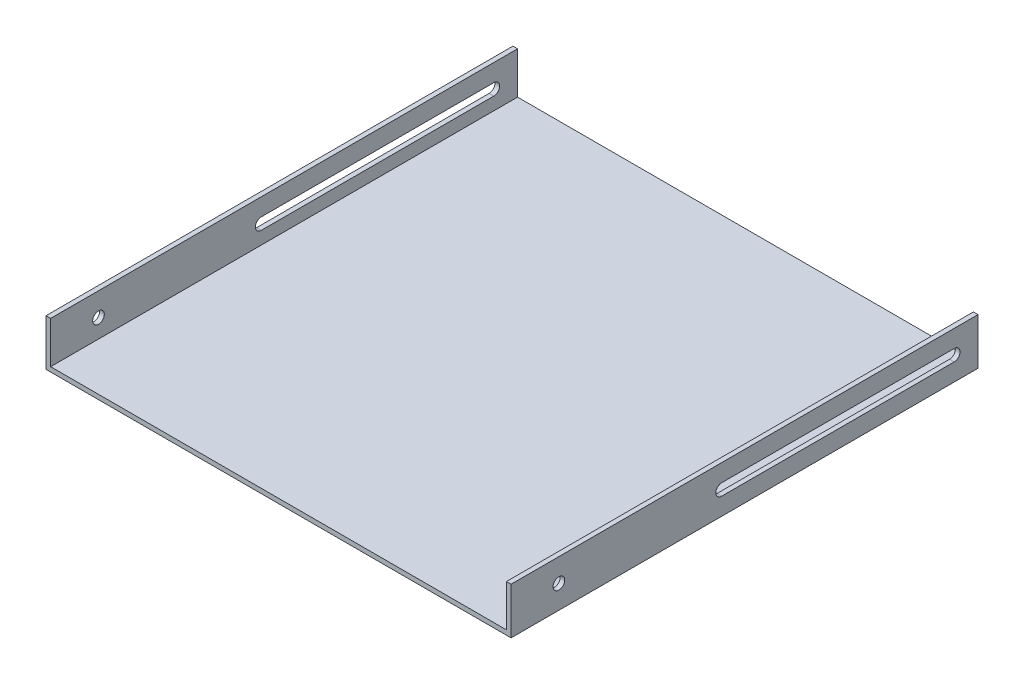
ISO-10303-21;
HEADER;
FILE_DESCRIPTION(('STEP AP214'),'2;1');
FILE_NAME('part.step','',(''),(''),'','','');
FILE_SCHEMA(('AUTOMOTIVE_DESIGN { 1 0 10303 214 1 1 1 1 }'));
ENDSEC;
DATA;
#1=APPLICATION_CONTEXT('core data for automotive mechanical design processes');
#2=APPLICATION_PROTOCOL_DEFINITION('international standard','automotive_design',2000,#1);
#3=PRODUCT_CONTEXT('',#1,'mechanical');
#4=PRODUCT('Part','Part','',(#3));
#5=PRODUCT_RELATED_PRODUCT_CATEGORY('part','',(#4));
#6=PRODUCT_DEFINITION_FORMATION('','',#4);
#7=PRODUCT_DEFINITION_CONTEXT('part definition',#1,'design');
#8=PRODUCT_DEFINITION('design','',#6,#7);
#9=PRODUCT_DEFINITION_SHAPE('','',#8);
#10=(LENGTH_UNIT() NAMED_UNIT(*) SI_UNIT(.MILLI.,.METRE.));
#11=(NAMED_UNIT(*) PLANE_ANGLE_UNIT() SI_UNIT($,.RADIAN.));
#12=(NAMED_UNIT(*) SI_UNIT($,.STERADIAN.) SOLID_ANGLE_UNIT());
#13=UNCERTAINTY_MEASURE_WITH_UNIT(LENGTH_MEASURE(1.E-05),#10,'distance_accuracy_value','');
#14=(GEOMETRIC_REPRESENTATION_CONTEXT(3) GLOBAL_UNCERTAINTY_ASSIGNED_CONTEXT((#13)) GLOBAL_UNIT_ASSIGNED_CONTEXT((#10,
#11,#12)) REPRESENTATION_CONTEXT('',''));
#15=CARTESIAN_POINT('',(0.,0.,0.));
#16=DIRECTION('',(0.,0.,1.));
#17=DIRECTION('',(1.,0.,0.));
#18=AXIS2_PLACEMENT_3D('',#15,#16,#17);
#19=CARTESIAN_POINT('',(-98.,1.99999999999999,160.));
#20=DIRECTION('',(-1.,0.,0.));
#21=DIRECTION('',(0.,0.,1.));
#22=AXIS2_PLACEMENT_3D('',#19,#20,#21);
#23=PLANE('',#22);
#24=CARTESIAN_POINT('',(-98.,10.,75.16));
#25=DIRECTION('',(-1.,0.,0.));
#26=DIRECTION('',(0.,0.,1.));
#27=AXIS2_PLACEMENT_3D('',#24,#25,#26);
#28=CIRCLE('',#27,2.5);
#29=CARTESIAN_POINT('',(-98.,10.,77.66));
#30=VERTEX_POINT('',#29);
#31=EDGE_CURVE('E209',#30,#30,#28,.T.);
#32=ORIENTED_EDGE('',*,*,#31,.T.);
#33=EDGE_LOOP('',(#32));
#34=FACE_BOUND('',#33,.T.);
#35=DIRECTION('',(0.,0.,1.));
#36=VECTOR('',#35,1.);
#37=CARTESIAN_POINT('',(-98.,7.49999999999998,160.));
#38=LINE('',#37,#36);
#39=CARTESIAN_POINT('',(-98.,7.50000000000001,-94.84));
#40=VERTEX_POINT('',#39);
#41=CARTESIAN_POINT('',(-98.,7.5,5.16000000000003));
#42=VERTEX_POINT('',#41);
#43=EDGE_CURVE('E252',#40,#42,#38,.T.);
#44=ORIENTED_EDGE('',*,*,#43,.T.);
#45=CARTESIAN_POINT('',(-98.,10.,5.16000000000002));
#46=DIRECTION('',(-1.,0.,0.));
#47=DIRECTION('',(0.,0.,1.));
#48=AXIS2_PLACEMENT_3D('',#45,#46,#47);
#49=CIRCLE('',#48,2.5);
#50=CARTESIAN_POINT('',(-98.,12.5,5.16000000000002));
#51=VERTEX_POINT('',#50);
#52=EDGE_CURVE('E210',#42,#51,#49,.T.);
#53=ORIENTED_EDGE('',*,*,#52,.T.);
#54=DIRECTION('',(0.,0.,-1.));
#55=VECTOR('',#54,1.);
#56=CARTESIAN_POINT('',(-98.,12.5,160.));
#57=LINE('',#56,#55);
#58=CARTESIAN_POINT('',(-98.,12.5,-94.84));
#59=VERTEX_POINT('',#58);
#60=EDGE_CURVE('E313',#51,#59,#57,.T.);
#61=ORIENTED_EDGE('',*,*,#60,.T.);
#62=CARTESIAN_POINT('',(-98.,10.,-94.84));
#63=DIRECTION('',(-1.,0.,0.));
#64=DIRECTION('',(0.,0.,1.));
#65=AXIS2_PLACEMENT_3D('',#62,#63,#64);
#66=CIRCLE('',#65,2.5);
#67=EDGE_CURVE('E309',#59,#40,#66,.T.);
#68=ORIENTED_EDGE('',*,*,#67,.T.);
#69=EDGE_LOOP('',(#44,#53,#61,#68));
#70=FACE_BOUND('',#69,.T.);
#71=DIRECTION('',(0.,0.,-1.));
#72=VECTOR('',#71,1.);
#73=CARTESIAN_POINT('',(-98.,20.,160.));
#74=LINE('',#73,#72);
#75=CARTESIAN_POINT('',(-98.,20.,95.73389712));
#76=VERTEX_POINT('',#75);
#77=CARTESIAN_POINT('',(-98.,20.,-105.06183505093));
#78=VERTEX_POINT('',#77);
#79=EDGE_CURVE('E182',#76,#78,#74,.T.);
#80=ORIENTED_EDGE('',*,*,#79,.F.);
#81=DIRECTION('',(0.,-1.,0.));
#82=VECTOR('',#81,1.);
#83=CARTESIAN_POINT('',(-98.,1.99999999999999,95.73389712));
#84=LINE('',#83,#82);
#85=CARTESIAN_POINT('',(-98.,1.99999999999999,95.73389712));
#86=VERTEX_POINT('',#85);
#87=EDGE_CURVE('E343',#76,#86,#84,.T.);
#88=ORIENTED_EDGE('',*,*,#87,.T.);
#89=DIRECTION('',(0.,0.,-1.));
#90=VECTOR('',#89,1.);
#91=CARTESIAN_POINT('',(-98.,1.99999999999999,160.));
#92=LINE('',#91,#90);
#93=CARTESIAN_POINT('',(-98.,1.99999999999999,-105.06183505093));
#94=VERTEX_POINT('',#93);
#95=EDGE_CURVE('E61',#86,#94,#92,.T.);
#96=ORIENTED_EDGE('',*,*,#95,.T.);
#97=DIRECTION('',(0.,1.,0.));
#98=VECTOR('',#97,1.);
#99=CARTESIAN_POINT('',(-98.,1.99999999999999,-105.06183505093));
#100=LINE('',#99,#98);
#101=EDGE_CURVE('E226',#94,#78,#100,.T.);
#102=ORIENTED_EDGE('',*,*,#101,.T.);
#103=EDGE_LOOP('',(#80,#88,#96,#102));
#104=FACE_BOUND('',#103,.T.);
#105=ADVANCED_FACE('F39',(#34,#70,#104),#23,.F.);
#106=CARTESIAN_POINT('',(-98.,20.,160.));
#107=DIRECTION('',(0.,-1.,0.));
#108=DIRECTION('',(1.,0.,0.));
#109=AXIS2_PLACEMENT_3D('',#106,#107,#108);
#110=PLANE('',#109);
#111=DIRECTION('',(0.,0.,-1.));
#112=VECTOR('',#111,1.);
#113=CARTESIAN_POINT('',(-100.,20.,160.));
#114=LINE('',#113,#112);
#115=CARTESIAN_POINT('',(-100.,20.,95.73389712));
#116=VERTEX_POINT('',#115);
#117=CARTESIAN_POINT('',(-100.,20.,-105.06183505093));
#118=VERTEX_POINT('',#117);
#119=EDGE_CURVE('E178',#116,#118,#114,.T.);
#120=ORIENTED_EDGE('',*,*,#119,.F.);
#121=DIRECTION('',(1.,0.,0.));
#122=VECTOR('',#121,1.);
#123=CARTESIAN_POINT('',(-98.,20.,95.73389712));
#124=LINE('',#123,#122);
#125=EDGE_CURVE('E157',#116,#76,#124,.T.);
#126=ORIENTED_EDGE('',*,*,#125,.T.);
#127=ORIENTED_EDGE('',*,*,#79,.T.);
#128=DIRECTION('',(-1.,0.,0.));
#129=VECTOR('',#128,1.);
#130=CARTESIAN_POINT('',(-98.,20.,-105.06183505093));
#131=LINE('',#130,#129);
#132=EDGE_CURVE('E243',#78,#118,#131,.T.);
#133=ORIENTED_EDGE('',*,*,#132,.T.);
#134=EDGE_LOOP('',(#120,#126,#127,#133));
#135=FACE_BOUND('',#134,.T.);
#136=ADVANCED_FACE('F355',(#135),#110,.F.);
#137=CARTESIAN_POINT('',(-100.,20.,160.));
#138=DIRECTION('',(1.,0.,0.));
#139=DIRECTION('',(0.,0.,-1.));
#140=AXIS2_PLACEMENT_3D('',#137,#138,#139);
#141=PLANE('',#140);
#142=CARTESIAN_POINT('',(-100.,10.,75.16));
#143=DIRECTION('',(1.,0.,0.));
#144=DIRECTION('',(0.,0.,-1.));
#145=AXIS2_PLACEMENT_3D('',#142,#143,#144);
#146=CIRCLE('',#145,2.5);
#147=CARTESIAN_POINT('',(-100.,10.,72.66));
#148=VERTEX_POINT('',#147);
#149=EDGE_CURVE('E248',#148,#148,#146,.T.);
#150=ORIENTED_EDGE('',*,*,#149,.T.);
#151=EDGE_LOOP('',(#150));
#152=FACE_BOUND('',#151,.T.);
#153=DIRECTION('',(0.,0.,1.));
#154=VECTOR('',#153,1.);
#155=CARTESIAN_POINT('',(-100.,12.5,5.16000000000002));
#156=LINE('',#155,#154);
#157=CARTESIAN_POINT('',(-100.,12.5,-94.84));
#158=VERTEX_POINT('',#157);
#159=CARTESIAN_POINT('',(-100.,12.5,5.16000000000002));
#160=VERTEX_POINT('',#159);
#161=EDGE_CURVE('E271',#158,#160,#156,.T.);
#162=ORIENTED_EDGE('',*,*,#161,.T.);
#163=CARTESIAN_POINT('',(-100.,10.,5.16000000000002));
#164=DIRECTION('',(1.,0.,0.));
#165=DIRECTION('',(0.,0.,-1.));
#166=AXIS2_PLACEMENT_3D('',#163,#164,#165);
#167=CIRCLE('',#166,2.5);
#168=CARTESIAN_POINT('',(-100.,7.5,5.16000000000002));
#169=VERTEX_POINT('',#168);
#170=EDGE_CURVE('E258',#160,#169,#167,.T.);
#171=ORIENTED_EDGE('',*,*,#170,.T.);
#172=DIRECTION('',(0.,0.,-1.));
#173=VECTOR('',#172,1.);
#174=CARTESIAN_POINT('',(-100.,7.5,5.16000000000002));
#175=LINE('',#174,#173);
#176=CARTESIAN_POINT('',(-100.,7.50000000000001,-94.84));
#177=VERTEX_POINT('',#176);
#178=EDGE_CURVE('E262',#169,#177,#175,.T.);
#179=ORIENTED_EDGE('',*,*,#178,.T.);
#180=CARTESIAN_POINT('',(-100.,10.,-94.84));
#181=DIRECTION('',(1.,0.,0.));
#182=DIRECTION('',(0.,0.,-1.));
#183=AXIS2_PLACEMENT_3D('',#180,#181,#182);
#184=CIRCLE('',#183,2.5);
#185=EDGE_CURVE('E267',#177,#158,#184,.T.);
#186=ORIENTED_EDGE('',*,*,#185,.T.);
#187=EDGE_LOOP('',(#162,#171,#179,#186));
#188=FACE_BOUND('',#187,.T.);
#189=DIRECTION('',(0.,0.,-1.));
#190=VECTOR('',#189,1.);
#191=CARTESIAN_POINT('',(-100.,0.,160.));
#192=LINE('',#191,#190);
#193=CARTESIAN_POINT('',(-100.,0.,95.73389712));
#194=VERTEX_POINT('',#193);
#195=CARTESIAN_POINT('',(-100.,0.,-105.06183505093));
#196=VERTEX_POINT('',#195);
#197=EDGE_CURVE('E168',#194,#196,#192,.T.);
#198=ORIENTED_EDGE('',*,*,#197,.F.);
#199=DIRECTION('',(0.,1.,0.));
#200=VECTOR('',#199,1.);
#201=CARTESIAN_POINT('',(-100.,0.,95.73389712));
#202=LINE('',#201,#200);
#203=EDGE_CURVE('E151',#194,#116,#202,.T.);
#204=ORIENTED_EDGE('',*,*,#203,.T.);
#205=ORIENTED_EDGE('',*,*,#119,.T.);
#206=DIRECTION('',(0.,-1.,0.));
#207=VECTOR('',#206,1.);
#208=CARTESIAN_POINT('',(-100.,0.,-105.06183505093));
#209=LINE('',#208,#207);
#210=EDGE_CURVE('E176',#118,#196,#209,.T.);
#211=ORIENTED_EDGE('',*,*,#210,.T.);
#212=EDGE_LOOP('',(#198,#204,#205,#211));
#213=FACE_BOUND('',#212,.T.);
#214=ADVANCED_FACE('F174',(#152,#188,#213),#141,.F.);
#215=CARTESIAN_POINT('',(-100.,0.,160.));
#216=DIRECTION('',(0.,1.,0.));
#217=DIRECTION('',(0.,0.,1.));
#218=AXIS2_PLACEMENT_3D('',#215,#216,#217);
#219=PLANE('',#218);
#220=DIRECTION('',(0.,0.,-1.));
#221=VECTOR('',#220,1.);
#222=CARTESIAN_POINT('',(100.,0.,160.));
#223=LINE('',#222,#221);
#224=CARTESIAN_POINT('',(100.,0.,95.73389712));
#225=VERTEX_POINT('',#224);
#226=CARTESIAN_POINT('',(100.,0.,-105.06183505093));
#227=VERTEX_POINT('',#226);
#228=EDGE_CURVE('E170',#225,#227,#223,.T.);
#229=ORIENTED_EDGE('',*,*,#228,.F.);
#230=DIRECTION('',(1.,0.,0.));
#231=VECTOR('',#230,1.);
#232=CARTESIAN_POINT('',(-100.,0.,95.73389712));
#233=LINE('',#232,#231);
#234=EDGE_CURVE('E154',#194,#225,#233,.T.);
#235=ORIENTED_EDGE('',*,*,#234,.F.);
#236=ORIENTED_EDGE('',*,*,#197,.T.);
#237=DIRECTION('',(1.,0.,0.));
#238=VECTOR('',#237,1.);
#239=CARTESIAN_POINT('',(-100.,0.,-105.06183505093));
#240=LINE('',#239,#238);
#241=EDGE_CURVE('E233',#196,#227,#240,.T.);
#242=ORIENTED_EDGE('',*,*,#241,.T.);
#243=EDGE_LOOP('',(#229,#235,#236,#242));
#244=FACE_BOUND('',#243,.T.);
#245=ADVANCED_FACE('F166',(#244),#219,.F.);
#246=CARTESIAN_POINT('',(100.,0.,160.));
#247=DIRECTION('',(-1.,0.,0.));
#248=DIRECTION('',(0.,0.,1.));
#249=AXIS2_PLACEMENT_3D('',#246,#247,#248);
#250=PLANE('',#249);
#251=CARTESIAN_POINT('',(100.,10.,75.16));
#252=DIRECTION('',(1.,0.,0.));
#253=DIRECTION('',(0.,0.,-1.));
#254=AXIS2_PLACEMENT_3D('',#251,#252,#253);
#255=CIRCLE('',#254,2.5);
#256=CARTESIAN_POINT('',(100.,10.,72.66));
#257=VERTEX_POINT('',#256);
#258=EDGE_CURVE('E253',#257,#257,#255,.T.);
#259=ORIENTED_EDGE('',*,*,#258,.F.);
#260=EDGE_LOOP('',(#259));
#261=FACE_BOUND('',#260,.T.);
#262=DIRECTION('',(0.,0.,-1.));
#263=VECTOR('',#262,1.);
#264=CARTESIAN_POINT('',(100.,7.5,5.16000000000002));
#265=LINE('',#264,#263);
#266=CARTESIAN_POINT('',(100.,7.5,5.16000000000003));
#267=VERTEX_POINT('',#266);
#268=CARTESIAN_POINT('',(100.,7.50000000000001,-94.84));
#269=VERTEX_POINT('',#268);
#270=EDGE_CURVE('E278',#267,#269,#265,.T.);
#271=ORIENTED_EDGE('',*,*,#270,.F.);
#272=CARTESIAN_POINT('',(100.,10.,5.16000000000002));
#273=DIRECTION('',(1.,0.,0.));
#274=DIRECTION('',(0.,0.,-1.));
#275=AXIS2_PLACEMENT_3D('',#272,#273,#274);
#276=CIRCLE('',#275,2.5);
#277=CARTESIAN_POINT('',(100.,12.5,5.16000000000002));
#278=VERTEX_POINT('',#277);
#279=EDGE_CURVE('E247',#278,#267,#276,.T.);
#280=ORIENTED_EDGE('',*,*,#279,.F.);
#281=DIRECTION('',(0.,0.,1.));
#282=VECTOR('',#281,1.);
#283=CARTESIAN_POINT('',(100.,12.5,5.16000000000002));
#284=LINE('',#283,#282);
#285=CARTESIAN_POINT('',(100.,12.5,-94.84));
#286=VERTEX_POINT('',#285);
#287=EDGE_CURVE('E263',#286,#278,#284,.T.);
#288=ORIENTED_EDGE('',*,*,#287,.F.);
#289=CARTESIAN_POINT('',(100.,10.,-94.84));
#290=DIRECTION('',(1.,0.,0.));
#291=DIRECTION('',(0.,0.,-1.));
#292=AXIS2_PLACEMENT_3D('',#289,#290,#291);
#293=CIRCLE('',#292,2.5);
#294=EDGE_CURVE('E282',#269,#286,#293,.T.);
#295=ORIENTED_EDGE('',*,*,#294,.F.);
#296=EDGE_LOOP('',(#271,#280,#288,#295));
#297=FACE_BOUND('',#296,.T.);
#298=DIRECTION('',(0.,0.,-1.));
#299=VECTOR('',#298,1.);
#300=CARTESIAN_POINT('',(100.,20.,160.));
#301=LINE('',#300,#299);
#302=CARTESIAN_POINT('',(100.,20.,95.73389712));
#303=VERTEX_POINT('',#302);
#304=CARTESIAN_POINT('',(100.,20.,-105.06183505093));
#305=VERTEX_POINT('',#304);
#306=EDGE_CURVE('E184',#303,#305,#301,.T.);
#307=ORIENTED_EDGE('',*,*,#306,.F.);
#308=DIRECTION('',(0.,1.,0.));
#309=VECTOR('',#308,1.);
#310=CARTESIAN_POINT('',(100.,0.,95.73389712));
#311=LINE('',#310,#309);
#312=EDGE_CURVE('E162',#225,#303,#311,.T.);
#313=ORIENTED_EDGE('',*,*,#312,.F.);
#314=ORIENTED_EDGE('',*,*,#228,.T.);
#315=DIRECTION('',(0.,-1.,0.));
#316=VECTOR('',#315,1.);
#317=CARTESIAN_POINT('',(100.,0.,-105.06183505093));
#318=LINE('',#317,#316);
#319=EDGE_CURVE('E337',#305,#227,#318,.T.);
#320=ORIENTED_EDGE('',*,*,#319,.F.);
#321=EDGE_LOOP('',(#307,#313,#314,#320));
#322=FACE_BOUND('',#321,.T.);
#323=ADVANCED_FACE('F338',(#261,#297,#322),#250,.F.);
#324=CARTESIAN_POINT('',(100.,20.,160.));
#325=DIRECTION('',(0.,-1.,0.));
#326=DIRECTION('',(1.,0.,0.));
#327=AXIS2_PLACEMENT_3D('',#324,#325,#326);
#328=PLANE('',#327);
#329=DIRECTION('',(0.,0.,-1.));
#330=VECTOR('',#329,1.);
#331=CARTESIAN_POINT('',(98.,20.,160.));
#332=LINE('',#331,#330);
#333=CARTESIAN_POINT('',(98.,20.,95.73389712));
#334=VERTEX_POINT('',#333);
#335=CARTESIAN_POINT('',(98.,20.,-105.06183505093));
#336=VERTEX_POINT('',#335);
#337=EDGE_CURVE('E230',#334,#336,#332,.T.);
#338=ORIENTED_EDGE('',*,*,#337,.F.);
#339=DIRECTION('',(1.,0.,0.));
#340=VECTOR('',#339,1.);
#341=CARTESIAN_POINT('',(100.,20.,95.73389712));
#342=LINE('',#341,#340);
#343=EDGE_CURVE('E333',#334,#303,#342,.T.);
#344=ORIENTED_EDGE('',*,*,#343,.T.);
#345=ORIENTED_EDGE('',*,*,#306,.T.);
#346=DIRECTION('',(-1.,0.,0.));
#347=VECTOR('',#346,1.);
#348=CARTESIAN_POINT('',(100.,20.,-105.06183505093));
#349=LINE('',#348,#347);
#350=EDGE_CURVE('E232',#305,#336,#349,.T.);
#351=ORIENTED_EDGE('',*,*,#350,.T.);
#352=EDGE_LOOP('',(#338,#344,#345,#351));
#353=FACE_BOUND('',#352,.T.);
#354=ADVANCED_FACE('F332',(#353),#328,.F.);
#355=CARTESIAN_POINT('',(98.,20.,160.));
#356=DIRECTION('',(1.,0.,0.));
#357=DIRECTION('',(0.,0.,-1.));
#358=AXIS2_PLACEMENT_3D('',#355,#356,#357);
#359=PLANE('',#358);
#360=CARTESIAN_POINT('',(98.,10.,75.16));
#361=DIRECTION('',(1.,0.,0.));
#362=DIRECTION('',(0.,0.,-1.));
#363=AXIS2_PLACEMENT_3D('',#360,#361,#362);
#364=CIRCLE('',#363,2.5);
#365=CARTESIAN_POINT('',(98.,10.,72.66));
#366=VERTEX_POINT('',#365);
#367=EDGE_CURVE('E206',#366,#366,#364,.T.);
#368=ORIENTED_EDGE('',*,*,#367,.T.);
#369=EDGE_LOOP('',(#368));
#370=FACE_BOUND('',#369,.T.);
#371=DIRECTION('',(0.,0.,1.));
#372=VECTOR('',#371,1.);
#373=CARTESIAN_POINT('',(98.,12.5,160.));
#374=LINE('',#373,#372);
#375=CARTESIAN_POINT('',(98.,12.5,-94.84));
#376=VERTEX_POINT('',#375);
#377=CARTESIAN_POINT('',(98.,12.5,5.16000000000002));
#378=VERTEX_POINT('',#377);
#379=EDGE_CURVE('E198',#376,#378,#374,.T.);
#380=ORIENTED_EDGE('',*,*,#379,.T.);
#381=CARTESIAN_POINT('',(98.,10.,5.16000000000002));
#382=DIRECTION('',(1.,0.,0.));
#383=DIRECTION('',(0.,0.,-1.));
#384=AXIS2_PLACEMENT_3D('',#381,#382,#383);
#385=CIRCLE('',#384,2.5);
#386=CARTESIAN_POINT('',(98.,7.5,5.16000000000002));
#387=VERTEX_POINT('',#386);
#388=EDGE_CURVE('E202',#378,#387,#385,.T.);
#389=ORIENTED_EDGE('',*,*,#388,.T.);
#390=DIRECTION('',(0.,0.,-1.));
#391=VECTOR('',#390,1.);
#392=CARTESIAN_POINT('',(98.,7.49999999999998,160.));
#393=LINE('',#392,#391);
#394=CARTESIAN_POINT('',(98.,7.50000000000001,-94.84));
#395=VERTEX_POINT('',#394);
#396=EDGE_CURVE('E190',#387,#395,#393,.T.);
#397=ORIENTED_EDGE('',*,*,#396,.T.);
#398=CARTESIAN_POINT('',(98.,10.,-94.84));
#399=DIRECTION('',(1.,0.,0.));
#400=DIRECTION('',(0.,0.,-1.));
#401=AXIS2_PLACEMENT_3D('',#398,#399,#400);
#402=CIRCLE('',#401,2.5);
#403=EDGE_CURVE('E194',#395,#376,#402,.T.);
#404=ORIENTED_EDGE('',*,*,#403,.T.);
#405=EDGE_LOOP('',(#380,#389,#397,#404));
#406=FACE_BOUND('',#405,.T.);
#407=DIRECTION('',(0.,0.,-1.));
#408=VECTOR('',#407,1.);
#409=CARTESIAN_POINT('',(98.,2.00000000000001,160.));
#410=LINE('',#409,#408);
#411=CARTESIAN_POINT('',(98.,2.00000000000001,95.73389712));
#412=VERTEX_POINT('',#411);
#413=CARTESIAN_POINT('',(98.,2.00000000000001,-105.06183505093));
#414=VERTEX_POINT('',#413);
#415=EDGE_CURVE('E217',#412,#414,#410,.T.);
#416=ORIENTED_EDGE('',*,*,#415,.F.);
#417=DIRECTION('',(0.,1.,0.));
#418=VECTOR('',#417,1.);
#419=CARTESIAN_POINT('',(98.,20.,95.73389712));
#420=LINE('',#419,#418);
#421=EDGE_CURVE('E54',#412,#334,#420,.T.);
#422=ORIENTED_EDGE('',*,*,#421,.T.);
#423=ORIENTED_EDGE('',*,*,#337,.T.);
#424=DIRECTION('',(0.,-1.,0.));
#425=VECTOR('',#424,1.);
#426=CARTESIAN_POINT('',(98.,20.,-105.06183505093));
#427=LINE('',#426,#425);
#428=EDGE_CURVE('E223',#336,#414,#427,.T.);
#429=ORIENTED_EDGE('',*,*,#428,.T.);
#430=EDGE_LOOP('',(#416,#422,#423,#429));
#431=FACE_BOUND('',#430,.T.);
#432=ADVANCED_FACE('F228',(#370,#406,#431),#359,.F.);
#433=CARTESIAN_POINT('',(98.,2.00000000000001,160.));
#434=DIRECTION('',(0.,-1.,0.));
#435=DIRECTION('',(1.,0.,0.));
#436=AXIS2_PLACEMENT_3D('',#433,#434,#435);
#437=PLANE('',#436);
#438=ORIENTED_EDGE('',*,*,#95,.F.);
#439=DIRECTION('',(1.,0.,0.));
#440=VECTOR('',#439,1.);
#441=CARTESIAN_POINT('',(98.,2.00000000000001,95.73389712));
#442=LINE('',#441,#440);
#443=EDGE_CURVE('E11',#86,#412,#442,.T.);
#444=ORIENTED_EDGE('',*,*,#443,.T.);
#445=ORIENTED_EDGE('',*,*,#415,.T.);
#446=DIRECTION('',(-1.,0.,0.));
#447=VECTOR('',#446,1.);
#448=CARTESIAN_POINT('',(98.,2.00000000000001,-105.06183505093));
#449=LINE('',#448,#447);
#450=EDGE_CURVE('E47',#414,#94,#449,.T.);
#451=ORIENTED_EDGE('',*,*,#450,.T.);
#452=EDGE_LOOP('',(#438,#444,#445,#451));
#453=FACE_BOUND('',#452,.T.);
#454=ADVANCED_FACE('F215',(#453),#437,.F.);
#455=CARTESIAN_POINT('',(-100.,7.5,5.16000000000002));
#456=DIRECTION('',(0.,-1.,0.));
#457=DIRECTION('',(0.,0.,-1.));
#458=AXIS2_PLACEMENT_3D('',#455,#456,#457);
#459=PLANE('',#458);
#460=DIRECTION('',(1.,0.,0.));
#461=VECTOR('',#460,1.);
#462=CARTESIAN_POINT('',(-100.,7.5,5.16000000000002));
#463=LINE('',#462,#461);
#464=EDGE_CURVE('E275',#387,#267,#463,.T.);
#465=ORIENTED_EDGE('',*,*,#464,.T.);
#466=ORIENTED_EDGE('',*,*,#270,.T.);
#467=DIRECTION('',(1.,0.,0.));
#468=VECTOR('',#467,1.);
#469=CARTESIAN_POINT('',(-100.,7.50000000000001,-94.84));
#470=LINE('',#469,#468);
#471=EDGE_CURVE('E302',#395,#269,#470,.T.);
#472=ORIENTED_EDGE('',*,*,#471,.F.);
#473=ORIENTED_EDGE('',*,*,#396,.F.);
#474=EDGE_LOOP('',(#465,#466,#472,#473));
#475=FACE_BOUND('',#474,.T.);
#476=ADVANCED_FACE('F377',(#475),#459,.F.);
#477=CARTESIAN_POINT('',(-100.,10.,-94.84));
#478=DIRECTION('',(1.,0.,0.));
#479=DIRECTION('',(0.,0.,-1.));
#480=AXIS2_PLACEMENT_3D('',#477,#478,#479);
#481=CYLINDRICAL_SURFACE('',#480,2.5);
#482=ORIENTED_EDGE('',*,*,#471,.T.);
#483=ORIENTED_EDGE('',*,*,#294,.T.);
#484=DIRECTION('',(1.,0.,0.));
#485=VECTOR('',#484,1.);
#486=CARTESIAN_POINT('',(-100.,12.5,-94.84));
#487=LINE('',#486,#485);
#488=EDGE_CURVE('E297',#376,#286,#487,.T.);
#489=ORIENTED_EDGE('',*,*,#488,.F.);
#490=ORIENTED_EDGE('',*,*,#403,.F.);
#491=EDGE_LOOP('',(#482,#483,#489,#490));
#492=FACE_BOUND('',#491,.T.);
#493=ADVANCED_FACE('F394',(#492),#481,.F.);
#494=CARTESIAN_POINT('',(-100.,12.5,5.16000000000002));
#495=DIRECTION('',(0.,1.,0.));
#496=DIRECTION('',(0.,0.,1.));
#497=AXIS2_PLACEMENT_3D('',#494,#495,#496);
#498=PLANE('',#497);
#499=ORIENTED_EDGE('',*,*,#488,.T.);
#500=ORIENTED_EDGE('',*,*,#287,.T.);
#501=DIRECTION('',(1.,0.,0.));
#502=VECTOR('',#501,1.);
#503=CARTESIAN_POINT('',(-100.,12.5,5.16000000000002));
#504=LINE('',#503,#502);
#505=EDGE_CURVE('E292',#378,#278,#504,.T.);
#506=ORIENTED_EDGE('',*,*,#505,.F.);
#507=ORIENTED_EDGE('',*,*,#379,.F.);
#508=EDGE_LOOP('',(#499,#500,#506,#507));
#509=FACE_BOUND('',#508,.T.);
#510=ADVANCED_FACE('F398',(#509),#498,.F.);
#511=CARTESIAN_POINT('',(-100.,10.,5.16000000000002));
#512=DIRECTION('',(1.,0.,0.));
#513=DIRECTION('',(0.,0.,-1.));
#514=AXIS2_PLACEMENT_3D('',#511,#512,#513);
#515=CYLINDRICAL_SURFACE('',#514,2.5);
#516=ORIENTED_EDGE('',*,*,#505,.T.);
#517=ORIENTED_EDGE('',*,*,#279,.T.);
#518=ORIENTED_EDGE('',*,*,#464,.F.);
#519=ORIENTED_EDGE('',*,*,#388,.F.);
#520=EDGE_LOOP('',(#516,#517,#518,#519));
#521=FACE_BOUND('',#520,.T.);
#522=ADVANCED_FACE('F384',(#521),#515,.F.);
#523=CARTESIAN_POINT('',(-100.,10.,75.16));
#524=DIRECTION('',(1.,0.,0.));
#525=DIRECTION('',(0.,0.,-1.));
#526=AXIS2_PLACEMENT_3D('',#523,#524,#525);
#527=CYLINDRICAL_SURFACE('',#526,2.5);
#528=ORIENTED_EDGE('',*,*,#258,.T.);
#529=EDGE_LOOP('',(#528));
#530=FACE_BOUND('',#529,.T.);
#531=ORIENTED_EDGE('',*,*,#367,.F.);
#532=EDGE_LOOP('',(#531));
#533=FACE_BOUND('',#532,.T.);
#534=ADVANCED_FACE('F382',(#530,#533),#527,.F.);
#535=EDGE_CURVE('E303',#169,#42,#463,.T.);
#536=ORIENTED_EDGE('',*,*,#535,.F.);
#537=ORIENTED_EDGE('',*,*,#170,.F.);
#538=EDGE_CURVE('E257',#160,#51,#504,.T.);
#539=ORIENTED_EDGE('',*,*,#538,.T.);
#540=ORIENTED_EDGE('',*,*,#52,.F.);
#541=EDGE_LOOP('',(#536,#537,#539,#540));
#542=FACE_BOUND('',#541,.T.);
#543=ADVANCED_FACE('F378',(#542),#515,.F.);
#544=ORIENTED_EDGE('',*,*,#538,.F.);
#545=ORIENTED_EDGE('',*,*,#161,.F.);
#546=EDGE_CURVE('E293',#158,#59,#487,.T.);
#547=ORIENTED_EDGE('',*,*,#546,.T.);
#548=ORIENTED_EDGE('',*,*,#60,.F.);
#549=EDGE_LOOP('',(#544,#545,#547,#548));
#550=FACE_BOUND('',#549,.T.);
#551=ADVANCED_FACE('F381',(#550),#498,.F.);
#552=ORIENTED_EDGE('',*,*,#546,.F.);
#553=ORIENTED_EDGE('',*,*,#185,.F.);
#554=EDGE_CURVE('E298',#177,#40,#470,.T.);
#555=ORIENTED_EDGE('',*,*,#554,.T.);
#556=ORIENTED_EDGE('',*,*,#67,.F.);
#557=EDGE_LOOP('',(#552,#553,#555,#556));
#558=FACE_BOUND('',#557,.T.);
#559=ADVANCED_FACE('F389',(#558),#481,.F.);
#560=ORIENTED_EDGE('',*,*,#554,.F.);
#561=ORIENTED_EDGE('',*,*,#178,.F.);
#562=ORIENTED_EDGE('',*,*,#535,.T.);
#563=ORIENTED_EDGE('',*,*,#43,.F.);
#564=EDGE_LOOP('',(#560,#561,#562,#563));
#565=FACE_BOUND('',#564,.T.);
#566=ADVANCED_FACE('F385',(#565),#459,.F.);
#567=ORIENTED_EDGE('',*,*,#149,.F.);
#568=EDGE_LOOP('',(#567));
#569=FACE_BOUND('',#568,.T.);
#570=ORIENTED_EDGE('',*,*,#31,.F.);
#571=EDGE_LOOP('',(#570));
#572=FACE_BOUND('',#571,.T.);
#573=ADVANCED_FACE('F388',(#569,#572),#527,.F.);
#574=CARTESIAN_POINT('',(-100.,0.,-105.06183505093));
#575=DIRECTION('',(0.,0.,1.));
#576=DIRECTION('',(1.,0.,0.));
#577=AXIS2_PLACEMENT_3D('',#574,#575,#576);
#578=PLANE('',#577);
#579=ORIENTED_EDGE('',*,*,#101,.F.);
#580=ORIENTED_EDGE('',*,*,#450,.F.);
#581=ORIENTED_EDGE('',*,*,#428,.F.);
#582=ORIENTED_EDGE('',*,*,#350,.F.);
#583=ORIENTED_EDGE('',*,*,#319,.T.);
#584=ORIENTED_EDGE('',*,*,#241,.F.);
#585=ORIENTED_EDGE('',*,*,#210,.F.);
#586=ORIENTED_EDGE('',*,*,#132,.F.);
#587=EDGE_LOOP('',(#579,#580,#581,#582,#583,#584,#585,#586));
#588=FACE_BOUND('',#587,.T.);
#589=ADVANCED_FACE('F221',(#588),#578,.F.);
#590=CARTESIAN_POINT('',(-100.,0.,95.73389712));
#591=DIRECTION('',(0.,0.,-1.));
#592=DIRECTION('',(-1.,0.,0.));
#593=AXIS2_PLACEMENT_3D('',#590,#591,#592);
#594=PLANE('',#593);
#595=ORIENTED_EDGE('',*,*,#203,.F.);
#596=ORIENTED_EDGE('',*,*,#234,.T.);
#597=ORIENTED_EDGE('',*,*,#312,.T.);
#598=ORIENTED_EDGE('',*,*,#343,.F.);
#599=ORIENTED_EDGE('',*,*,#421,.F.);
#600=ORIENTED_EDGE('',*,*,#443,.F.);
#601=ORIENTED_EDGE('',*,*,#87,.F.);
#602=ORIENTED_EDGE('',*,*,#125,.F.);
#603=EDGE_LOOP('',(#595,#596,#597,#598,#599,#600,#601,#602));
#604=FACE_BOUND('',#603,.T.);
#605=ADVANCED_FACE('F153',(#604),#594,.F.);
#606=CLOSED_SHELL('',(#105,#136,#214,#245,#323,#354,#432,#454,#476,#493,#510,#522,#534,#543,
#551,#559,#566,#573,#589,#605));
#607=MANIFOLD_SOLID_BREP('B2',#606);
#608=ADVANCED_BREP_SHAPE_REPRESENTATION('',(#18,#607),#14);
#609=SHAPE_DEFINITION_REPRESENTATION(#9,#608);
ENDSEC;
END-ISO-10303-21;
